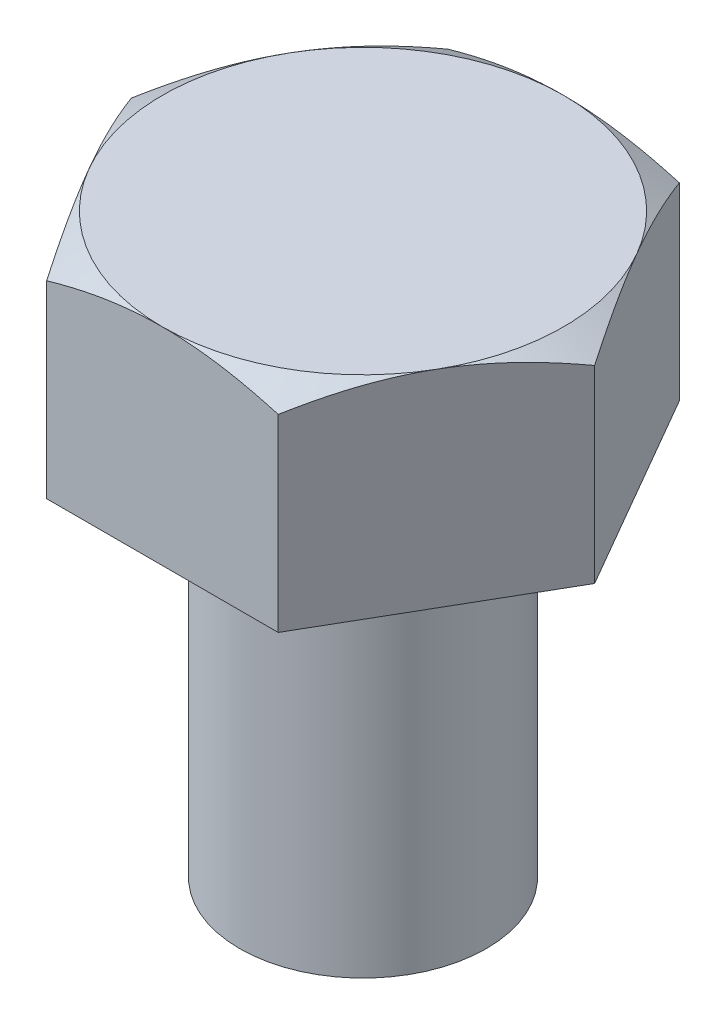
ISO-10303-21;
HEADER;
FILE_DESCRIPTION(('STEP AP214'),'2;1');
FILE_NAME('part.step','',(''),(''),'','','');
FILE_SCHEMA(('AUTOMOTIVE_DESIGN { 1 0 10303 214 1 1 1 1 }'));
ENDSEC;
DATA;
#1=APPLICATION_CONTEXT('core data for automotive mechanical design processes');
#2=APPLICATION_PROTOCOL_DEFINITION('international standard','automotive_design',2000,#1);
#3=PRODUCT_CONTEXT('',#1,'mechanical');
#4=PRODUCT('Part','Part','',(#3));
#5=PRODUCT_RELATED_PRODUCT_CATEGORY('part','',(#4));
#6=PRODUCT_DEFINITION_FORMATION('','',#4);
#7=PRODUCT_DEFINITION_CONTEXT('part definition',#1,'design');
#8=PRODUCT_DEFINITION('design','',#6,#7);
#9=PRODUCT_DEFINITION_SHAPE('','',#8);
#10=(LENGTH_UNIT() NAMED_UNIT(*) SI_UNIT(.MILLI.,.METRE.));
#11=(NAMED_UNIT(*) PLANE_ANGLE_UNIT() SI_UNIT($,.RADIAN.));
#12=(NAMED_UNIT(*) SI_UNIT($,.STERADIAN.) SOLID_ANGLE_UNIT());
#13=UNCERTAINTY_MEASURE_WITH_UNIT(LENGTH_MEASURE(1.E-05),#10,'distance_accuracy_value','');
#14=(GEOMETRIC_REPRESENTATION_CONTEXT(3) GLOBAL_UNCERTAINTY_ASSIGNED_CONTEXT((#13)) GLOBAL_UNIT_ASSIGNED_CONTEXT((#10,
#11,#12)) REPRESENTATION_CONTEXT('',''));
#15=CARTESIAN_POINT('',(0.,0.,0.));
#16=DIRECTION('',(0.,0.,1.));
#17=DIRECTION('',(1.,0.,0.));
#18=AXIS2_PLACEMENT_3D('',#15,#16,#17);
#19=CARTESIAN_POINT('',(3.75277674973257,6.7,6.5));
#20=DIRECTION('',(-0.866025403784439,0.,-0.5));
#21=DIRECTION('',(-0.5,0.,0.866025403784439));
#22=AXIS2_PLACEMENT_3D('',#19,#20,#21);
#23=PLANE('',#22);
#24=CARTESIAN_POINT('',(3.75266127967873,6.11937674819413,6.5002));
#25=CARTESIAN_POINT('',(3.8351516191275,6.16699557692451,6.35732254094112));
#26=CARTESIAN_POINT('',(3.91794952254312,6.21245329939729,6.21391236546509));
#27=CARTESIAN_POINT('',(4.08421773795795,6.29845131797695,5.92592736868281));
#28=CARTESIAN_POINT('',(4.16768832359105,6.33898949277197,5.78135207342874));
#29=CARTESIAN_POINT('',(4.41943655294051,6.45242899887679,5.34531134947997));
#30=CARTESIAN_POINT('',(4.58870793403689,6.51695219287126,5.05212471715368));
#31=CARTESIAN_POINT('',(4.84201947708215,6.59261341645251,4.61337625445563));
#32=CARTESIAN_POINT('',(4.92530276780316,6.61416714354301,4.46912536350531));
#33=CARTESIAN_POINT('',(5.09224566542477,6.65030968539388,4.17997178286191));
#34=CARTESIAN_POINT('',(5.17590523841627,6.66489911554033,4.03506915190111));
#35=CARTESIAN_POINT('',(5.34336968579964,6.68674124749265,3.74501222057168));
#36=CARTESIAN_POINT('',(5.427174286676,6.69400227567789,3.59985839394579));
#37=CARTESIAN_POINT('',(5.59485627940483,6.70103969741777,3.30942466302505));
#38=CARTESIAN_POINT('',(5.6787336689286,6.7008163221878,3.16414476276364));
#39=CARTESIAN_POINT('',(5.90853103021317,6.68991654148484,2.76612405757351));
#40=CARTESIAN_POINT('',(6.05437578112763,6.67161818213059,2.51351353897243));
#41=CARTESIAN_POINT('',(6.34509659313134,6.61359365854233,2.00997032176432));
#42=CARTESIAN_POINT('',(6.48997163178544,6.57384766146176,1.75903939406692));
#43=CARTESIAN_POINT('',(6.78127752911038,6.47449409679785,1.25448277935568));
#44=CARTESIAN_POINT('',(6.92767163007067,6.41446557436198,1.00092075856409));
#45=CARTESIAN_POINT('',(7.21827667013276,6.27822500749013,0.497578064240954));
#46=CARTESIAN_POINT('',(7.36249133098588,6.20204496583641,0.247790944447035));
#47=CARTESIAN_POINT('',(7.50566896951897,6.11937674819414,-0.00020000000000124));
#48=B_SPLINE_CURVE_WITH_KNOTS('',3,(#24,#25,#26,#27,#28,#29,#30,#31,#32,#33,#34,#35,#36,#37,#38,
#39,#40,#41,#42,#43,#44,#45,#46,#47),.UNSPECIFIED.,.F.,.F.,(4,2,2,2,2,2,2,2,2,2,2,4),(0.,
0.515105052395587,1.03043143507524,2.06322554824262,2.56697389547996,3.07067772176454,
3.57380860368928,4.0769239424252,4.9527935470566,5.82947446853466,6.72559912449736,
7.61996451221046),.UNSPECIFIED.);
#49=CARTESIAN_POINT('',(3.75277674973257,6.11944341639924,6.5));
#50=VERTEX_POINT('',#49);
#51=CARTESIAN_POINT('',(5.62916512459885,6.7,3.25));
#52=VERTEX_POINT('',#51);
#53=EDGE_CURVE('E108',#50,#52,#48,.T.);
#54=ORIENTED_EDGE('',*,*,#53,.F.);
#55=DIRECTION('',(0.,-1.,0.));
#56=VECTOR('',#55,1.);
#57=CARTESIAN_POINT('',(3.75277674973257,6.7,6.5));
#58=LINE('',#57,#56);
#59=CARTESIAN_POINT('',(3.75277674973257,0.,6.5));
#60=VERTEX_POINT('',#59);
#61=EDGE_CURVE('E57',#50,#60,#58,.T.);
#62=ORIENTED_EDGE('',*,*,#61,.T.);
#63=DIRECTION('',(0.5,0.,-0.866025403784439));
#64=VECTOR('',#63,1.);
#65=CARTESIAN_POINT('',(3.75277674973257,0.,6.5));
#66=LINE('',#65,#64);
#67=CARTESIAN_POINT('',(7.50555349946513,0.,0.));
#68=VERTEX_POINT('',#67);
#69=EDGE_CURVE('E231',#60,#68,#66,.T.);
#70=ORIENTED_EDGE('',*,*,#69,.T.);
#71=DIRECTION('',(0.,-1.,0.));
#72=VECTOR('',#71,1.);
#73=CARTESIAN_POINT('',(7.50555349946513,6.7,0.));
#74=LINE('',#73,#72);
#75=CARTESIAN_POINT('',(7.50555349946513,6.11944341639924,0.));
#76=VERTEX_POINT('',#75);
#77=EDGE_CURVE('E128',#76,#68,#74,.T.);
#78=ORIENTED_EDGE('',*,*,#77,.F.);
#79=EDGE_CURVE('E116',#52,#76,#48,.T.);
#80=ORIENTED_EDGE('',*,*,#79,.F.);
#81=EDGE_LOOP('',(#54,#62,#70,#78,#80));
#82=FACE_BOUND('',#81,.T.);
#83=ADVANCED_FACE('F34',(#82),#23,.F.);
#84=CARTESIAN_POINT('',(7.50555349946513,6.7,0.));
#85=DIRECTION('',(-0.866025403784439,0.,0.5));
#86=DIRECTION('',(0.5,0.,0.866025403784439));
#87=AXIS2_PLACEMENT_3D('',#84,#85,#86);
#88=PLANE('',#87);
#89=CARTESIAN_POINT('',(7.50566896951897,6.11937674819414,0.000199999999998265));
#90=CARTESIAN_POINT('',(7.4231786300702,6.16699557692452,-0.142677459058882));
#91=CARTESIAN_POINT('',(7.34038072665458,6.2124532993973,-0.286087634534915));
#92=CARTESIAN_POINT('',(7.17411251123975,6.29845131797696,-0.574072631317196));
#93=CARTESIAN_POINT('',(7.09064192560665,6.33898949277198,-0.718647926571265));
#94=CARTESIAN_POINT('',(6.83889369625718,6.45242899887679,-1.15468865052004));
#95=CARTESIAN_POINT('',(6.6696223151608,6.51695219287126,-1.44787528284632));
#96=CARTESIAN_POINT('',(6.41631077211555,6.59261341645251,-1.88662374554438));
#97=CARTESIAN_POINT('',(6.33302748139454,6.61416714354301,-2.03087463649469));
#98=CARTESIAN_POINT('',(6.16608458377293,6.65030968539388,-2.32002821713809));
#99=CARTESIAN_POINT('',(6.08242501078143,6.66489911554034,-2.46493084809889));
#100=CARTESIAN_POINT('',(5.91496056339806,6.68674124749266,-2.75498777942832));
#101=CARTESIAN_POINT('',(5.8311559625217,6.69400227567789,-2.90014160605421));
#102=CARTESIAN_POINT('',(5.66347396979286,6.70103969741777,-3.19057533697495));
#103=CARTESIAN_POINT('',(5.5795965802691,6.7008163221878,-3.33585523723636));
#104=CARTESIAN_POINT('',(5.34979921898453,6.68991654148484,-3.7338759424265));
#105=CARTESIAN_POINT('',(5.20395446807007,6.67161818213059,-3.98648646102757));
#106=CARTESIAN_POINT('',(4.91323365606635,6.61359365854233,-4.49002967823568));
#107=CARTESIAN_POINT('',(4.76835861741226,6.57384766146176,-4.74096060593308));
#108=CARTESIAN_POINT('',(4.47705272008731,6.47449409679785,-5.24551722064432));
#109=CARTESIAN_POINT('',(4.33065861912702,6.41446557436197,-5.49907924143592));
#110=CARTESIAN_POINT('',(4.04005357906493,6.27822500749013,-6.00242193575905));
#111=CARTESIAN_POINT('',(3.89583891821181,6.20204496583641,-6.25220905555297));
#112=CARTESIAN_POINT('',(3.75266127967872,6.11937674819413,-6.5002));
#113=B_SPLINE_CURVE_WITH_KNOTS('',3,(#89,#90,#91,#92,#93,#94,#95,#96,#97,#98,#99,#100,#101,#102,
#103,#104,#105,#106,#107,#108,#109,#110,#111,#112),.UNSPECIFIED.,.F.,.F.,(4,2,2,2,2,2,2,2,2,2,2,
4),(0.,0.515105052395587,1.03043143507525,2.06322554824262,2.56697389547996,3.07067772176454,
3.57380860368928,4.0769239424252,4.9527935470566,5.82947446853466,6.72559912449736,
7.61996451221046),.UNSPECIFIED.);
#114=CARTESIAN_POINT('',(5.62916512459885,6.7,-3.25));
#115=VERTEX_POINT('',#114);
#116=EDGE_CURVE('E121',#76,#115,#113,.T.);
#117=ORIENTED_EDGE('',*,*,#116,.F.);
#118=ORIENTED_EDGE('',*,*,#77,.T.);
#119=DIRECTION('',(-0.5,0.,-0.866025403784439));
#120=VECTOR('',#119,1.);
#121=CARTESIAN_POINT('',(7.50555349946513,0.,0.));
#122=LINE('',#121,#120);
#123=CARTESIAN_POINT('',(3.75277674973256,0.,-6.5));
#124=VERTEX_POINT('',#123);
#125=EDGE_CURVE('E233',#68,#124,#122,.T.);
#126=ORIENTED_EDGE('',*,*,#125,.T.);
#127=DIRECTION('',(0.,-1.,0.));
#128=VECTOR('',#127,1.);
#129=CARTESIAN_POINT('',(3.75277674973256,6.7,-6.5));
#130=LINE('',#129,#128);
#131=CARTESIAN_POINT('',(3.75277674973256,6.11944341639924,-6.5));
#132=VERTEX_POINT('',#131);
#133=EDGE_CURVE('E198',#132,#124,#130,.T.);
#134=ORIENTED_EDGE('',*,*,#133,.F.);
#135=EDGE_CURVE('E129',#115,#132,#113,.T.);
#136=ORIENTED_EDGE('',*,*,#135,.F.);
#137=EDGE_LOOP('',(#117,#118,#126,#134,#136));
#138=FACE_BOUND('',#137,.T.);
#139=ADVANCED_FACE('F186',(#138),#88,.F.);
#140=CARTESIAN_POINT('',(3.75277674973256,6.7,-6.5));
#141=DIRECTION('',(0.,0.,1.));
#142=DIRECTION('',(1.,0.,0.));
#143=AXIS2_PLACEMENT_3D('',#140,#141,#142);
#144=PLANE('',#143);
#145=CARTESIAN_POINT('',(13.8139574839022,1.638481138491,-6.5));
#146=CARTESIAN_POINT('',(13.4947578749117,1.8052129854467,-6.5));
#147=CARTESIAN_POINT('',(13.1751418170336,1.97115381776682,-6.5));
#148=CARTESIAN_POINT('',(12.5348714808293,2.30105181516063,-6.5));
#149=CARTESIAN_POINT('',(12.214217160334,2.46500889834968,-6.5));
#150=CARTESIAN_POINT('',(11.5712213982228,2.790761987783,-6.5));
#151=CARTESIAN_POINT('',(11.2488781751313,2.95255448307862,-6.5));
#152=CARTESIAN_POINT('',(10.6027206269845,3.27316738465073,-6.5));
#153=CARTESIAN_POINT('',(10.2789063230105,3.43198783335214,-6.5));
#154=CARTESIAN_POINT('',(9.61111812232705,3.75480761022855,-6.5));
#155=CARTESIAN_POINT('',(9.26703994535626,3.91859174236744,-6.5));
#156=CARTESIAN_POINT('',(8.57641376277764,4.24086640422094,-6.5));
#157=CARTESIAN_POINT('',(8.22986581221207,4.3993570514632,-6.5));
#158=CARTESIAN_POINT('',(7.5338610877251,4.70937363012269,-6.5));
#159=CARTESIAN_POINT('',(7.18440582182577,4.86090293513315,-6.5));
#160=CARTESIAN_POINT('',(6.48169158604273,5.15486607955537,-6.5));
#161=CARTESIAN_POINT('',(6.12843297310925,5.2973007639645,-6.5));
#162=CARTESIAN_POINT('',(5.57460316315303,5.50962187767637,-6.5));
#163=CARTESIAN_POINT('',(5.37564660154839,5.58371844057531,-6.5));
#164=CARTESIAN_POINT('',(4.97611812983457,5.72740901984083,-6.5));
#165=CARTESIAN_POINT('',(4.77554628716944,5.79700322311299,-6.5));
#166=CARTESIAN_POINT('',(4.37257457265818,5.93089416179073,-6.5));
#167=CARTESIAN_POINT('',(4.17017427962262,5.9951896402097,-6.5));
#168=CARTESIAN_POINT('',(3.76350131637173,6.11750295845697,-6.5));
#169=CARTESIAN_POINT('',(3.55922864739788,6.17552080244738,-6.5));
#170=CARTESIAN_POINT('',(2.95188177995611,6.33630258698443,-6.5));
#171=CARTESIAN_POINT('',(2.54589528580563,6.42866402323896,-6.5));
#172=CARTESIAN_POINT('',(1.93203171481707,6.53934037146583,-6.5));
#173=CARTESIAN_POINT('',(1.72662601898748,6.57158558927994,-6.5));
#174=CARTESIAN_POINT('',(1.31443945331926,6.62578872168969,-6.5));
#175=CARTESIAN_POINT('',(1.10765860381055,6.64774678802653,-6.5));
#176=CARTESIAN_POINT('',(0.689475403516405,6.68087510951589,-6.5));
#177=CARTESIAN_POINT('',(0.478056920550247,6.691843832712,-6.5));
#178=CARTESIAN_POINT('',(0.0549352048653565,6.7018505847048,-6.5));
#179=CARTESIAN_POINT('',(-0.156768025854096,6.70088869683639,-6.5));
#180=CARTESIAN_POINT('',(-0.579805286711263,6.68707342791541,-6.5));
#181=CARTESIAN_POINT('',(-0.791139271964379,6.67421868997946,-6.5));
#182=CARTESIAN_POINT('',(-1.21279995927692,6.63713148411202,-6.5));
#183=CARTESIAN_POINT('',(-1.42312663306409,6.61289869870101,-6.5));
#184=CARTESIAN_POINT('',(-1.84681078367043,6.55330791444443,-6.5));
#185=CARTESIAN_POINT('',(-2.06013576661383,6.5177212015982,-6.5));
#186=CARTESIAN_POINT('',(-2.48492973034277,6.43678162586307,-6.5));
#187=CARTESIAN_POINT('',(-2.69639850742024,6.39142770468657,-6.5));
#188=CARTESIAN_POINT('',(-3.11739584040897,6.29219973032877,-6.5));
#189=CARTESIAN_POINT('',(-3.32692362852299,6.23832244613893,-6.5));
#190=CARTESIAN_POINT('',(-3.74395471379609,6.12327957618005,-6.5));
#191=CARTESIAN_POINT('',(-3.95145800915378,6.06211398392651,-6.5));
#192=CARTESIAN_POINT('',(-4.3760072108456,5.93003046784393,-6.5));
#193=CARTESIAN_POINT('',(-4.5929427352531,5.85875951198126,-6.5));
#194=CARTESIAN_POINT('',(-5.02484062022631,5.71045357893135,-6.5));
#195=CARTESIAN_POINT('',(-5.23980284369903,5.63341820461916,-6.5));
#196=CARTESIAN_POINT('',(-5.66799544480579,5.47451545749527,-6.5));
#197=CARTESIAN_POINT('',(-5.88122532330472,5.3926467445769,-6.5));
#198=CARTESIAN_POINT('',(-6.30609550877733,5.22487505024035,-6.5));
#199=CARTESIAN_POINT('',(-6.51773575410909,5.13897191330475,-6.5));
#200=CARTESIAN_POINT('',(-7.15117541561197,4.87595583121997,-6.5));
#201=CARTESIAN_POINT('',(-7.57086928815009,4.69377242146831,-6.5));
#202=CARTESIAN_POINT('',(-8.40584724616036,4.3198304230341,-6.5));
#203=CARTESIAN_POINT('',(-8.82113201587074,4.12807334720428,-6.5));
#204=CARTESIAN_POINT('',(-9.62157149533409,3.75016186639188,-6.5));
#205=CARTESIAN_POINT('',(-10.0069354022297,3.56444914350493,-6.5));
#206=CARTESIAN_POINT('',(-10.775374194308,3.18831438168644,-6.5));
#207=CARTESIAN_POINT('',(-11.1584489710136,2.99789212174308,-6.5));
#208=CARTESIAN_POINT('',(-11.9211125407583,2.61424057192128,-6.5));
#209=CARTESIAN_POINT('',(-12.3007092445575,2.42102697244457,-6.5));
#210=CARTESIAN_POINT('',(-13.0583809727052,2.03173085268914,-6.5));
#211=CARTESIAN_POINT('',(-13.4364561480045,1.83564862642425,-6.5));
#212=CARTESIAN_POINT('',(-13.8139574839022,1.63848113849099,-6.5));
#213=B_SPLINE_CURVE_WITH_KNOTS('',3,(#145,#146,#147,#148,#149,#150,#151,#152,#153,#154,#155,
#156,#157,#158,#159,#160,#161,#162,#163,#164,#165,#166,#167,#168,#169,#170,#171,#172,#173,#174,
#175,#176,#177,#178,#179,#180,#181,#182,#183,#184,#185,#186,#187,#188,#189,#190,#191,#192,#193,
#194,#195,#196,#197,#198,#199,#200,#201,#202,#203,#204,#205,#206,#207,#208,#209,#210,#211,#212),
.UNSPECIFIED.,.F.,.F.,(4,2,2,2,2,2,2,2,2,2,2,2,2,2,2,2,2,2,2,2,2,2,2,2,2,2,2,2,2,2,2,2,2,4),(0.,
1.08036939650545,2.16078323709755,3.24277705397165,4.32475541396608,5.46793398205869,
6.61108715204124,7.75368035558055,8.89616724381069,9.53304245716421,10.1698912150519,
10.806890616691,11.4438895959946,12.691350062509,13.3149035198612,13.9384477791637,
14.573228595022,15.2080049769613,15.8428537909716,16.4777203201015,17.126282042099,
17.7749140718493,18.4237925746996,19.0726716548699,19.7576036400822,20.442582855462,
21.1277528904918,21.8129493589049,23.1853441893397,24.5575228330005,25.840817132885,
27.1241717706328,28.4019793488425,29.6796568658503),.UNSPECIFIED.);
#214=CARTESIAN_POINT('',(0.,6.7,-6.5));
#215=VERTEX_POINT('',#214);
#216=EDGE_CURVE('E180',#132,#215,#213,.T.);
#217=ORIENTED_EDGE('',*,*,#216,.F.);
#218=ORIENTED_EDGE('',*,*,#133,.T.);
#219=DIRECTION('',(-1.,0.,0.));
#220=VECTOR('',#219,1.);
#221=CARTESIAN_POINT('',(3.75277674973256,0.,-6.5));
#222=LINE('',#221,#220);
#223=CARTESIAN_POINT('',(-3.75277674973257,0.,-6.5));
#224=VERTEX_POINT('',#223);
#225=EDGE_CURVE('E216',#124,#224,#222,.T.);
#226=ORIENTED_EDGE('',*,*,#225,.T.);
#227=DIRECTION('',(0.,-1.,0.));
#228=VECTOR('',#227,1.);
#229=CARTESIAN_POINT('',(-3.75277674973257,6.7,-6.5));
#230=LINE('',#229,#228);
#231=CARTESIAN_POINT('',(-3.75277674973257,6.11944341639924,-6.5));
#232=VERTEX_POINT('',#231);
#233=EDGE_CURVE('E214',#232,#224,#230,.T.);
#234=ORIENTED_EDGE('',*,*,#233,.F.);
#235=EDGE_CURVE('E174',#215,#232,#213,.T.);
#236=ORIENTED_EDGE('',*,*,#235,.F.);
#237=EDGE_LOOP('',(#217,#218,#226,#234,#236));
#238=FACE_BOUND('',#237,.T.);
#239=ADVANCED_FACE('F182',(#238),#144,.F.);
#240=CARTESIAN_POINT('',(-3.75277674973257,6.7,-6.5));
#241=DIRECTION('',(0.866025403784439,0.,0.5));
#242=DIRECTION('',(0.5,0.,-0.866025403784439));
#243=AXIS2_PLACEMENT_3D('',#240,#241,#242);
#244=PLANE('',#243);
#245=CARTESIAN_POINT('',(-3.75266127967873,6.11937674819413,-6.5002));
#246=CARTESIAN_POINT('',(-3.83515161912751,6.16699557692451,-6.35732254094112));
#247=CARTESIAN_POINT('',(-3.91794952254312,6.21245329939729,-6.21391236546509));
#248=CARTESIAN_POINT('',(-4.08421773795795,6.29845131797695,-5.92592736868281));
#249=CARTESIAN_POINT('',(-4.16768832359106,6.33898949277197,-5.78135207342874));
#250=CARTESIAN_POINT('',(-4.41943655294052,6.45242899887679,-5.34531134947997));
#251=CARTESIAN_POINT('',(-4.5887079340369,6.51695219287126,-5.05212471715368));
#252=CARTESIAN_POINT('',(-4.84201947708215,6.59261341645251,-4.61337625445563));
#253=CARTESIAN_POINT('',(-4.92530276780316,6.61416714354301,-4.46912536350531));
#254=CARTESIAN_POINT('',(-5.09224566542477,6.65030968539388,-4.17997178286191));
#255=CARTESIAN_POINT('',(-5.17590523841628,6.66489911554033,-4.03506915190111));
#256=CARTESIAN_POINT('',(-5.34336968579964,6.68674124749265,-3.74501222057168));
#257=CARTESIAN_POINT('',(-5.427174286676,6.69400227567789,-3.59985839394579));
#258=CARTESIAN_POINT('',(-5.59485627940484,6.70103969741777,-3.30942466302505));
#259=CARTESIAN_POINT('',(-5.6787336689286,6.70081632218779,-3.16414476276364));
#260=CARTESIAN_POINT('',(-5.90853103021317,6.68991654148483,-2.76612405757351));
#261=CARTESIAN_POINT('',(-6.05437578112764,6.67161818213059,-2.51351353897243));
#262=CARTESIAN_POINT('',(-6.34509659313135,6.61359365854232,-2.00997032176432));
#263=CARTESIAN_POINT('',(-6.48997163178545,6.57384766146176,-1.75903939406692));
#264=CARTESIAN_POINT('',(-6.78127752911039,6.47449409679785,-1.25448277935568));
#265=CARTESIAN_POINT('',(-6.92767163007068,6.41446557436197,-1.00092075856409));
#266=CARTESIAN_POINT('',(-7.21827667013277,6.27822500749013,-0.497578064240955));
#267=CARTESIAN_POINT('',(-7.36249133098589,6.20204496583641,-0.247790944447036));
#268=CARTESIAN_POINT('',(-7.50566896951897,6.11937674819413,0.000200000000001128));
#269=B_SPLINE_CURVE_WITH_KNOTS('',3,(#245,#246,#247,#248,#249,#250,#251,#252,#253,#254,#255,
#256,#257,#258,#259,#260,#261,#262,#263,#264,#265,#266,#267,#268),.UNSPECIFIED.,.F.,.F.,(4,2,2,
2,2,2,2,2,2,2,2,4),(0.,0.515105052395588,1.03043143507525,2.06322554824262,2.56697389547996,
3.07067772176454,3.57380860368928,4.0769239424252,4.9527935470566,5.82947446853467,
6.72559912449737,7.61996451221046),.UNSPECIFIED.);
#270=CARTESIAN_POINT('',(-5.62916512459885,6.7,-3.25));
#271=VERTEX_POINT('',#270);
#272=EDGE_CURVE('E181',#232,#271,#269,.T.);
#273=ORIENTED_EDGE('',*,*,#272,.F.);
#274=ORIENTED_EDGE('',*,*,#233,.T.);
#275=DIRECTION('',(-0.5,0.,0.866025403784439));
#276=VECTOR('',#275,1.);
#277=CARTESIAN_POINT('',(-3.75277674973257,0.,-6.5));
#278=LINE('',#277,#276);
#279=CARTESIAN_POINT('',(-7.50555349946514,0.,0.));
#280=VERTEX_POINT('',#279);
#281=EDGE_CURVE('E236',#224,#280,#278,.T.);
#282=ORIENTED_EDGE('',*,*,#281,.T.);
#283=DIRECTION('',(0.,-1.,0.));
#284=VECTOR('',#283,1.);
#285=CARTESIAN_POINT('',(-7.50555349946514,6.7,0.));
#286=LINE('',#285,#284);
#287=CARTESIAN_POINT('',(-7.50555349946514,6.11944341639924,0.));
#288=VERTEX_POINT('',#287);
#289=EDGE_CURVE('E220',#288,#280,#286,.T.);
#290=ORIENTED_EDGE('',*,*,#289,.F.);
#291=EDGE_CURVE('E168',#271,#288,#269,.T.);
#292=ORIENTED_EDGE('',*,*,#291,.F.);
#293=EDGE_LOOP('',(#273,#274,#282,#290,#292));
#294=FACE_BOUND('',#293,.T.);
#295=ADVANCED_FACE('F185',(#294),#244,.F.);
#296=CARTESIAN_POINT('',(-7.50555349946514,6.7,0.));
#297=DIRECTION('',(0.866025403784439,0.,-0.5));
#298=DIRECTION('',(-0.5,0.,-0.866025403784439));
#299=AXIS2_PLACEMENT_3D('',#296,#297,#298);
#300=PLANE('',#299);
#301=CARTESIAN_POINT('',(-7.50566896951897,6.11937674819413,-0.000199999999999142));
#302=CARTESIAN_POINT('',(-7.4231786300702,6.16699557692451,0.142677459058881));
#303=CARTESIAN_POINT('',(-7.34038072665458,6.21245329939729,0.286087634534914));
#304=CARTESIAN_POINT('',(-7.17411251123976,6.29845131797695,0.574072631317196));
#305=CARTESIAN_POINT('',(-7.09064192560665,6.33898949277197,0.718647926571265));
#306=CARTESIAN_POINT('',(-6.83889369625719,6.45242899887679,1.15468865052004));
#307=CARTESIAN_POINT('',(-6.66962231516081,6.51695219287126,1.44787528284632));
#308=CARTESIAN_POINT('',(-6.41631077211555,6.59261341645251,1.88662374554438));
#309=CARTESIAN_POINT('',(-6.33302748139454,6.61416714354301,2.03087463649469));
#310=CARTESIAN_POINT('',(-6.16608458377293,6.65030968539388,2.32002821713809));
#311=CARTESIAN_POINT('',(-6.08242501078143,6.66489911554033,2.46493084809889));
#312=CARTESIAN_POINT('',(-5.91496056339807,6.68674124749265,2.75498777942832));
#313=CARTESIAN_POINT('',(-5.8311559625217,6.69400227567789,2.90014160605421));
#314=CARTESIAN_POINT('',(-5.66347396979287,6.70103969741777,3.19057533697495));
#315=CARTESIAN_POINT('',(-5.5795965802691,6.70081632218779,3.33585523723636));
#316=CARTESIAN_POINT('',(-5.34979921898453,6.68991654148483,3.7338759424265));
#317=CARTESIAN_POINT('',(-5.20395446807007,6.67161818213059,3.98648646102757));
#318=CARTESIAN_POINT('',(-4.91323365606636,6.61359365854232,4.49002967823568));
#319=CARTESIAN_POINT('',(-4.76835861741226,6.57384766146176,4.74096060593309));
#320=CARTESIAN_POINT('',(-4.47705272008732,6.47449409679785,5.24551722064433));
#321=CARTESIAN_POINT('',(-4.33065861912703,6.41446557436197,5.49907924143592));
#322=CARTESIAN_POINT('',(-4.04005357906494,6.27822500749013,6.00242193575905));
#323=CARTESIAN_POINT('',(-3.89583891821182,6.20204496583641,6.25220905555297));
#324=CARTESIAN_POINT('',(-3.75266127967873,6.11937674819413,6.5002));
#325=B_SPLINE_CURVE_WITH_KNOTS('',3,(#301,#302,#303,#304,#305,#306,#307,#308,#309,#310,#311,
#312,#313,#314,#315,#316,#317,#318,#319,#320,#321,#322,#323,#324),.UNSPECIFIED.,.F.,.F.,(4,2,2,
2,2,2,2,2,2,2,2,4),(0.,0.515105052395588,1.03043143507525,2.06322554824262,2.56697389547996,
3.07067772176454,3.57380860368928,4.0769239424252,4.9527935470566,5.82947446853467,
6.72559912449736,7.61996451221046),.UNSPECIFIED.);
#326=CARTESIAN_POINT('',(-5.62916512459885,6.7,3.25));
#327=VERTEX_POINT('',#326);
#328=EDGE_CURVE('E259',#288,#327,#325,.T.);
#329=ORIENTED_EDGE('',*,*,#328,.F.);
#330=ORIENTED_EDGE('',*,*,#289,.T.);
#331=DIRECTION('',(0.5,0.,0.866025403784439));
#332=VECTOR('',#331,1.);
#333=CARTESIAN_POINT('',(-7.50555349946514,0.,0.));
#334=LINE('',#333,#332);
#335=CARTESIAN_POINT('',(-3.75277674973257,0.,6.5));
#336=VERTEX_POINT('',#335);
#337=EDGE_CURVE('E238',#280,#336,#334,.T.);
#338=ORIENTED_EDGE('',*,*,#337,.T.);
#339=DIRECTION('',(0.,-1.,0.));
#340=VECTOR('',#339,1.);
#341=CARTESIAN_POINT('',(-3.75277674973257,6.7,6.5));
#342=LINE('',#341,#340);
#343=CARTESIAN_POINT('',(-3.75277674973257,6.11944341639924,6.5));
#344=VERTEX_POINT('',#343);
#345=EDGE_CURVE('E223',#344,#336,#342,.T.);
#346=ORIENTED_EDGE('',*,*,#345,.F.);
#347=EDGE_CURVE('E161',#327,#344,#325,.T.);
#348=ORIENTED_EDGE('',*,*,#347,.F.);
#349=EDGE_LOOP('',(#329,#330,#338,#346,#348));
#350=FACE_BOUND('',#349,.T.);
#351=ADVANCED_FACE('F254',(#350),#300,.F.);
#352=CARTESIAN_POINT('',(-3.75277674973257,6.7,6.5));
#353=DIRECTION('',(0.,0.,-1.));
#354=DIRECTION('',(-1.,0.,0.));
#355=AXIS2_PLACEMENT_3D('',#352,#353,#354);
#356=PLANE('',#355);
#357=CARTESIAN_POINT('',(-13.8139574839022,1.63848113849099,6.5));
#358=CARTESIAN_POINT('',(-13.4947578749117,1.80521298544669,6.5));
#359=CARTESIAN_POINT('',(-13.1751418170336,1.97115381776681,6.5));
#360=CARTESIAN_POINT('',(-12.5348714808294,2.30105181516063,6.5));
#361=CARTESIAN_POINT('',(-12.214217160334,2.46500889834967,6.5));
#362=CARTESIAN_POINT('',(-11.5712213982228,2.790761987783,6.5));
#363=CARTESIAN_POINT('',(-11.2488781751313,2.95255448307862,6.5));
#364=CARTESIAN_POINT('',(-10.6027206269845,3.27316738465072,6.5));
#365=CARTESIAN_POINT('',(-10.2789063230105,3.43198783335213,6.5));
#366=CARTESIAN_POINT('',(-9.61111812232706,3.75480761022855,6.5));
#367=CARTESIAN_POINT('',(-9.26703994535627,3.91859174236743,6.5));
#368=CARTESIAN_POINT('',(-8.57641376277765,4.24086640422094,6.5));
#369=CARTESIAN_POINT('',(-8.22986581221208,4.3993570514632,6.5));
#370=CARTESIAN_POINT('',(-7.53386108772511,4.70937363012269,6.5));
#371=CARTESIAN_POINT('',(-7.18440582182578,4.86090293513315,6.5));
#372=CARTESIAN_POINT('',(-6.48169158604274,5.15486607955536,6.5));
#373=CARTESIAN_POINT('',(-6.12843297310926,5.29730076396449,6.5));
#374=CARTESIAN_POINT('',(-5.57460316315303,5.50962187767637,6.5));
#375=CARTESIAN_POINT('',(-5.37564660154839,5.58371844057531,6.5));
#376=CARTESIAN_POINT('',(-4.97611812983457,5.72740901984083,6.5));
#377=CARTESIAN_POINT('',(-4.77554628716944,5.79700322311299,6.5));
#378=CARTESIAN_POINT('',(-4.37257457265819,5.93089416179073,6.5));
#379=CARTESIAN_POINT('',(-4.17017427962263,5.9951896402097,6.5));
#380=CARTESIAN_POINT('',(-3.76350131637173,6.11750295845697,6.5));
#381=CARTESIAN_POINT('',(-3.55922864739788,6.17552080244738,6.5));
#382=CARTESIAN_POINT('',(-2.95188177995612,6.33630258698443,6.5));
#383=CARTESIAN_POINT('',(-2.54589528580563,6.42866402323896,6.5));
#384=CARTESIAN_POINT('',(-1.93203171481708,6.53934037146583,6.5));
#385=CARTESIAN_POINT('',(-1.72662601898749,6.57158558927994,6.5));
#386=CARTESIAN_POINT('',(-1.31443945331927,6.62578872168969,6.5));
#387=CARTESIAN_POINT('',(-1.10765860381055,6.64774678802653,6.5));
#388=CARTESIAN_POINT('',(-0.689475403516409,6.68087510951589,6.5));
#389=CARTESIAN_POINT('',(-0.478056920550251,6.691843832712,6.5));
#390=CARTESIAN_POINT('',(-0.0549352048653592,6.7018505847048,6.5));
#391=CARTESIAN_POINT('',(0.156768025854093,6.70088869683639,6.5));
#392=CARTESIAN_POINT('',(0.579805286711261,6.68707342791541,6.5));
#393=CARTESIAN_POINT('',(0.791139271964378,6.67421868997946,6.5));
#394=CARTESIAN_POINT('',(1.21279995927692,6.63713148411202,6.5));
#395=CARTESIAN_POINT('',(1.42312663306409,6.61289869870101,6.5));
#396=CARTESIAN_POINT('',(1.84681078367043,6.55330791444443,6.5));
#397=CARTESIAN_POINT('',(2.06013576661383,6.5177212015982,6.5));
#398=CARTESIAN_POINT('',(2.48492973034277,6.43678162586307,6.5));
#399=CARTESIAN_POINT('',(2.69639850742025,6.39142770468657,6.5));
#400=CARTESIAN_POINT('',(3.11739584040897,6.29219973032877,6.5));
#401=CARTESIAN_POINT('',(3.32692362852299,6.23832244613893,6.5));
#402=CARTESIAN_POINT('',(3.74395471379609,6.12327957618005,6.5));
#403=CARTESIAN_POINT('',(3.95145800915377,6.06211398392651,6.5));
#404=CARTESIAN_POINT('',(4.3760072108456,5.93003046784394,6.5));
#405=CARTESIAN_POINT('',(4.5929427352531,5.85875951198127,6.5));
#406=CARTESIAN_POINT('',(5.02484062022631,5.71045357893135,6.5));
#407=CARTESIAN_POINT('',(5.23980284369902,5.63341820461917,6.5));
#408=CARTESIAN_POINT('',(5.66799544480579,5.47451545749527,6.5));
#409=CARTESIAN_POINT('',(5.88122532330471,5.3926467445769,6.5));
#410=CARTESIAN_POINT('',(6.30609550877732,5.22487505024035,6.5));
#411=CARTESIAN_POINT('',(6.51773575410908,5.13897191330475,6.5));
#412=CARTESIAN_POINT('',(7.15117541561196,4.87595583121997,6.5));
#413=CARTESIAN_POINT('',(7.57086928815009,4.69377242146831,6.5));
#414=CARTESIAN_POINT('',(8.40584724616035,4.3198304230341,6.5));
#415=CARTESIAN_POINT('',(8.82113201587073,4.12807334720429,6.5));
#416=CARTESIAN_POINT('',(9.62157149533408,3.75016186639189,6.5));
#417=CARTESIAN_POINT('',(10.0069354022297,3.56444914350494,6.5));
#418=CARTESIAN_POINT('',(10.775374194308,3.18831438168644,6.5));
#419=CARTESIAN_POINT('',(11.1584489710136,2.99789212174308,6.5));
#420=CARTESIAN_POINT('',(11.9211125407583,2.61424057192128,6.5));
#421=CARTESIAN_POINT('',(12.3007092445575,2.42102697244457,6.5));
#422=CARTESIAN_POINT('',(13.0583809727052,2.03173085268914,6.5));
#423=CARTESIAN_POINT('',(13.4364561480045,1.83564862642425,6.5));
#424=CARTESIAN_POINT('',(13.8139574839022,1.638481138491,6.5));
#425=B_SPLINE_CURVE_WITH_KNOTS('',3,(#357,#358,#359,#360,#361,#362,#363,#364,#365,#366,#367,
#368,#369,#370,#371,#372,#373,#374,#375,#376,#377,#378,#379,#380,#381,#382,#383,#384,#385,#386,
#387,#388,#389,#390,#391,#392,#393,#394,#395,#396,#397,#398,#399,#400,#401,#402,#403,#404,#405,
#406,#407,#408,#409,#410,#411,#412,#413,#414,#415,#416,#417,#418,#419,#420,#421,#422,#423,#424),
.UNSPECIFIED.,.F.,.F.,(4,2,2,2,2,2,2,2,2,2,2,2,2,2,2,2,2,2,2,2,2,2,2,2,2,2,2,2,2,2,2,2,2,4),(0.,
1.08036939650545,2.16078323709755,3.24277705397166,4.32475541396608,5.46793398205869,
6.61108715204125,7.75368035558056,8.8961672438107,9.53304245716422,10.1698912150519,
10.806890616691,11.4438895959946,12.691350062509,13.3149035198612,13.9384477791637,
14.573228595022,15.2080049769613,15.8428537909717,16.4777203201015,17.126282042099,
17.7749140718494,18.4237925746996,19.0726716548699,19.7576036400823,20.442582855462,
21.1277528904918,21.8129493589049,23.1853441893397,24.5575228330005,25.8408171328851,
27.1241717706328,28.4019793488425,29.6796568658503),.UNSPECIFIED.);
#426=CARTESIAN_POINT('',(0.,6.7,6.5));
#427=VERTEX_POINT('',#426);
#428=EDGE_CURVE('E249',#344,#427,#425,.T.);
#429=ORIENTED_EDGE('',*,*,#428,.F.);
#430=ORIENTED_EDGE('',*,*,#345,.T.);
#431=DIRECTION('',(1.,0.,0.));
#432=VECTOR('',#431,1.);
#433=CARTESIAN_POINT('',(-3.75277674973257,0.,6.5));
#434=LINE('',#433,#432);
#435=EDGE_CURVE('E241',#336,#60,#434,.T.);
#436=ORIENTED_EDGE('',*,*,#435,.T.);
#437=ORIENTED_EDGE('',*,*,#61,.F.);
#438=EDGE_CURVE('E113',#427,#50,#425,.T.);
#439=ORIENTED_EDGE('',*,*,#438,.F.);
#440=EDGE_LOOP('',(#429,#430,#436,#437,#439));
#441=FACE_BOUND('',#440,.T.);
#442=ADVANCED_FACE('F246',(#441),#356,.F.);
#443=CARTESIAN_POINT('',(0.,0.,0.));
#444=DIRECTION('',(0.,1.,0.));
#445=DIRECTION('',(0.,0.,1.));
#446=AXIS2_PLACEMENT_3D('',#443,#444,#445);
#447=PLANE('',#446);
#448=CARTESIAN_POINT('',(0.,0.,0.));
#449=DIRECTION('',(0.,-1.,0.));
#450=DIRECTION('',(0.,0.,-1.));
#451=AXIS2_PLACEMENT_3D('',#448,#449,#450);
#452=CIRCLE('',#451,4.);
#453=CARTESIAN_POINT('',(0.,0.,-4.));
#454=VERTEX_POINT('',#453);
#455=EDGE_CURVE('E226',#454,#454,#452,.T.);
#456=ORIENTED_EDGE('',*,*,#455,.F.);
#457=EDGE_LOOP('',(#456));
#458=FACE_BOUND('',#457,.T.);
#459=ORIENTED_EDGE('',*,*,#69,.F.);
#460=ORIENTED_EDGE('',*,*,#435,.F.);
#461=ORIENTED_EDGE('',*,*,#337,.F.);
#462=ORIENTED_EDGE('',*,*,#281,.F.);
#463=ORIENTED_EDGE('',*,*,#225,.F.);
#464=ORIENTED_EDGE('',*,*,#125,.F.);
#465=EDGE_LOOP('',(#459,#460,#461,#462,#463,#464));
#466=FACE_BOUND('',#465,.T.);
#467=ADVANCED_FACE('F257',(#458,#466),#447,.F.);
#468=CARTESIAN_POINT('',(0.,-12.,0.));
#469=DIRECTION('',(0.,1.,0.));
#470=DIRECTION('',(0.,0.,1.));
#471=AXIS2_PLACEMENT_3D('',#468,#469,#470);
#472=CYLINDRICAL_SURFACE('',#471,4.);
#473=CARTESIAN_POINT('',(0.,-12.,0.));
#474=DIRECTION('',(0.,-1.,0.));
#475=DIRECTION('',(0.,0.,-1.));
#476=AXIS2_PLACEMENT_3D('',#473,#474,#475);
#477=CIRCLE('',#476,4.);
#478=CARTESIAN_POINT('',(0.,-12.,-4.));
#479=VERTEX_POINT('',#478);
#480=EDGE_CURVE('E115',#479,#479,#477,.T.);
#481=ORIENTED_EDGE('',*,*,#480,.F.);
#482=EDGE_LOOP('',(#481));
#483=FACE_BOUND('',#482,.T.);
#484=ORIENTED_EDGE('',*,*,#455,.T.);
#485=EDGE_LOOP('',(#484));
#486=FACE_BOUND('',#485,.T.);
#487=ADVANCED_FACE('F270',(#483,#486),#472,.T.);
#488=CARTESIAN_POINT('',(0.,-12.,0.));
#489=DIRECTION('',(0.,-1.,0.));
#490=DIRECTION('',(0.,0.,-1.));
#491=AXIS2_PLACEMENT_3D('',#488,#489,#490);
#492=PLANE('',#491);
#493=ORIENTED_EDGE('',*,*,#480,.T.);
#494=EDGE_LOOP('',(#493));
#495=FACE_BOUND('',#494,.T.);
#496=ADVANCED_FACE('F147',(#495),#492,.T.);
#497=CARTESIAN_POINT('',(0.,6.7,0.));
#498=DIRECTION('',(0.,-1.,0.));
#499=DIRECTION('',(0.,0.,1.));
#500=AXIS2_PLACEMENT_3D('',#497,#498,#499);
#501=CONICAL_SURFACE('',#500,6.5,1.0471975511966);
#502=ORIENTED_EDGE('',*,*,#347,.T.);
#503=ORIENTED_EDGE('',*,*,#428,.T.);
#504=CARTESIAN_POINT('',(0.,6.7,0.));
#505=DIRECTION('',(0.,1.,0.));
#506=DIRECTION('',(0.,0.,1.));
#507=AXIS2_PLACEMENT_3D('',#504,#505,#506);
#508=CIRCLE('',#507,6.5);
#509=EDGE_CURVE('E38',#327,#427,#508,.T.);
#510=ORIENTED_EDGE('',*,*,#509,.F.);
#511=EDGE_LOOP('',(#502,#503,#510));
#512=FACE_BOUND('',#511,.T.);
#513=ADVANCED_FACE('F146',(#512),#501,.T.);
#514=ORIENTED_EDGE('',*,*,#291,.T.);
#515=ORIENTED_EDGE('',*,*,#328,.T.);
#516=EDGE_CURVE('E211',#271,#327,#508,.T.);
#517=ORIENTED_EDGE('',*,*,#516,.F.);
#518=EDGE_LOOP('',(#514,#515,#517));
#519=FACE_BOUND('',#518,.T.);
#520=ADVANCED_FACE('F261',(#519),#501,.T.);
#521=ORIENTED_EDGE('',*,*,#235,.T.);
#522=ORIENTED_EDGE('',*,*,#272,.T.);
#523=EDGE_CURVE('E206',#215,#271,#508,.T.);
#524=ORIENTED_EDGE('',*,*,#523,.F.);
#525=EDGE_LOOP('',(#521,#522,#524));
#526=FACE_BOUND('',#525,.T.);
#527=ADVANCED_FACE('F207',(#526),#501,.T.);
#528=ORIENTED_EDGE('',*,*,#135,.T.);
#529=ORIENTED_EDGE('',*,*,#216,.T.);
#530=EDGE_CURVE('E43',#115,#215,#508,.T.);
#531=ORIENTED_EDGE('',*,*,#530,.F.);
#532=EDGE_LOOP('',(#528,#529,#531));
#533=FACE_BOUND('',#532,.T.);
#534=ADVANCED_FACE('F202',(#533),#501,.T.);
#535=ORIENTED_EDGE('',*,*,#79,.T.);
#536=ORIENTED_EDGE('',*,*,#116,.T.);
#537=EDGE_CURVE('E12',#52,#115,#508,.T.);
#538=ORIENTED_EDGE('',*,*,#537,.F.);
#539=EDGE_LOOP('',(#535,#536,#538));
#540=FACE_BOUND('',#539,.T.);
#541=ADVANCED_FACE('F119',(#540),#501,.T.);
#542=ORIENTED_EDGE('',*,*,#53,.T.);
#543=CARTESIAN_POINT('',(0.,6.7,0.));
#544=DIRECTION('',(0.,1.,0.));
#545=DIRECTION('',(0.,0.,1.));
#546=AXIS2_PLACEMENT_3D('',#543,#544,#545);
#547=CIRCLE('',#546,6.5);
#548=EDGE_CURVE('E111',#427,#52,#547,.T.);
#549=ORIENTED_EDGE('',*,*,#548,.F.);
#550=ORIENTED_EDGE('',*,*,#438,.T.);
#551=EDGE_LOOP('',(#542,#549,#550));
#552=FACE_BOUND('',#551,.T.);
#553=ADVANCED_FACE('F110',(#552),#501,.T.);
#554=CARTESIAN_POINT('',(0.,6.7,0.));
#555=DIRECTION('',(0.,1.,0.));
#556=DIRECTION('',(0.,0.,1.));
#557=AXIS2_PLACEMENT_3D('',#554,#555,#556);
#558=PLANE('',#557);
#559=ORIENTED_EDGE('',*,*,#509,.T.);
#560=ORIENTED_EDGE('',*,*,#548,.T.);
#561=ORIENTED_EDGE('',*,*,#537,.T.);
#562=ORIENTED_EDGE('',*,*,#530,.T.);
#563=ORIENTED_EDGE('',*,*,#523,.T.);
#564=ORIENTED_EDGE('',*,*,#516,.T.);
#565=EDGE_LOOP('',(#559,#560,#561,#562,#563,#564));
#566=FACE_BOUND('',#565,.T.);
#567=ADVANCED_FACE('F125',(#566),#558,.T.);
#568=CLOSED_SHELL('',(#83,#139,#239,#295,#351,#442,#467,#487,#496,#513,#520,#527,#534,#541,#553,#567));
#569=MANIFOLD_SOLID_BREP('B2',#568);
#570=ADVANCED_BREP_SHAPE_REPRESENTATION('',(#18,#569),#14);
#571=SHAPE_DEFINITION_REPRESENTATION(#9,#570);
ENDSEC;
END-ISO-10303-21;
